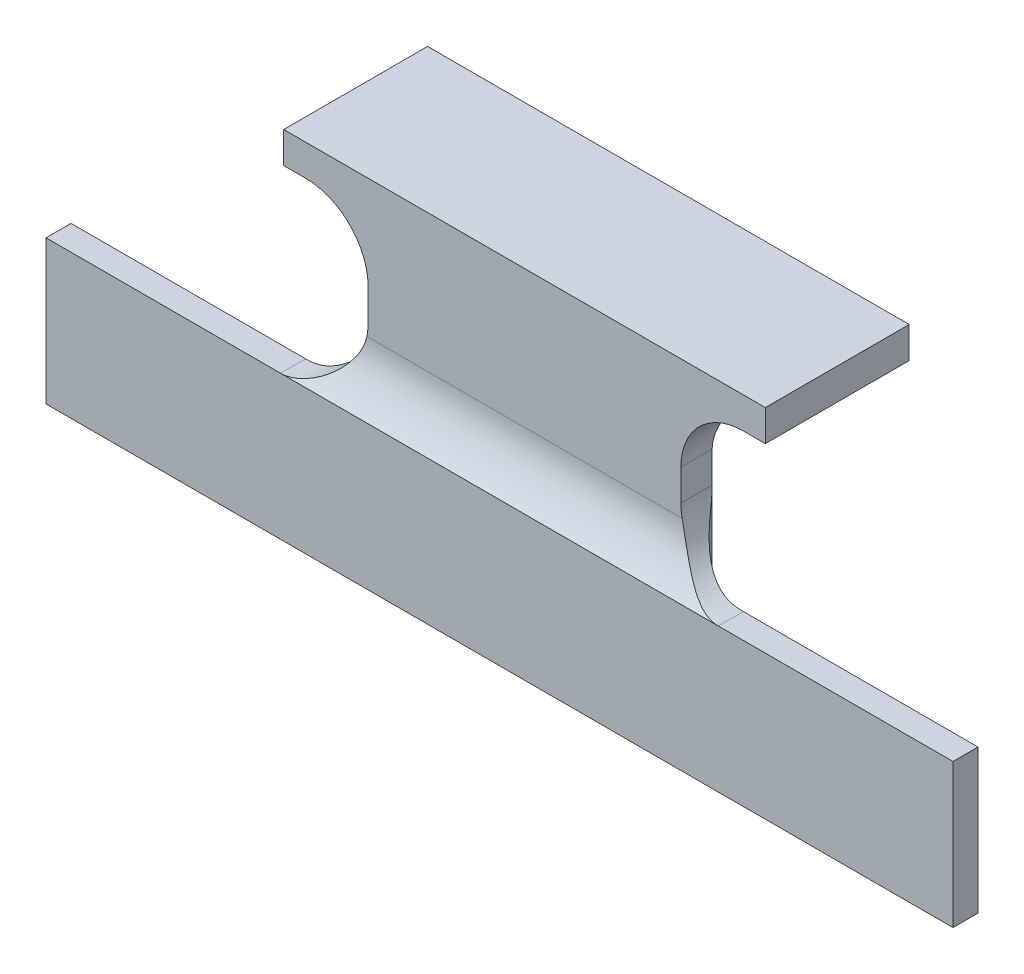
ISO-10303-21;
HEADER;
FILE_DESCRIPTION(('STEP AP214'),'2;1');
FILE_NAME('part.step','',(''),(''),'','','');
FILE_SCHEMA(('AUTOMOTIVE_DESIGN { 1 0 10303 214 1 1 1 1 }'));
ENDSEC;
DATA;
#1=APPLICATION_CONTEXT('core data for automotive mechanical design processes');
#2=APPLICATION_PROTOCOL_DEFINITION('international standard','automotive_design',2000,#1);
#3=PRODUCT_CONTEXT('',#1,'mechanical');
#4=PRODUCT('Part','Part','',(#3));
#5=PRODUCT_RELATED_PRODUCT_CATEGORY('part','',(#4));
#6=PRODUCT_DEFINITION_FORMATION('','',#4);
#7=PRODUCT_DEFINITION_CONTEXT('part definition',#1,'design');
#8=PRODUCT_DEFINITION('design','',#6,#7);
#9=PRODUCT_DEFINITION_SHAPE('','',#8);
#10=(LENGTH_UNIT() NAMED_UNIT(*) SI_UNIT(.MILLI.,.METRE.));
#11=(NAMED_UNIT(*) PLANE_ANGLE_UNIT() SI_UNIT($,.RADIAN.));
#12=(NAMED_UNIT(*) SI_UNIT($,.STERADIAN.) SOLID_ANGLE_UNIT());
#13=UNCERTAINTY_MEASURE_WITH_UNIT(LENGTH_MEASURE(1.E-05),#10,'distance_accuracy_value','');
#14=(GEOMETRIC_REPRESENTATION_CONTEXT(3) GLOBAL_UNCERTAINTY_ASSIGNED_CONTEXT((#13)) GLOBAL_UNIT_ASSIGNED_CONTEXT((#10,
#11,#12)) REPRESENTATION_CONTEXT('',''));
#15=CARTESIAN_POINT('',(0.,0.,0.));
#16=DIRECTION('',(0.,0.,1.));
#17=DIRECTION('',(1.,0.,0.));
#18=AXIS2_PLACEMENT_3D('',#15,#16,#17);
#19=CARTESIAN_POINT('',(-72.5,11.5,4.));
#20=DIRECTION('',(0.,-1.,0.));
#21=DIRECTION('',(0.,0.,-1.));
#22=AXIS2_PLACEMENT_3D('',#19,#20,#21);
#23=PLANE('',#22);
#24=DIRECTION('',(-1.,0.,0.));
#25=VECTOR('',#24,1.);
#26=CARTESIAN_POINT('',(-72.5,11.5,0.));
#27=LINE('',#26,#25);
#28=CARTESIAN_POINT('',(72.5,11.5,0.));
#29=VERTEX_POINT('',#28);
#30=CARTESIAN_POINT('',(35.,11.5,0.));
#31=VERTEX_POINT('',#30);
#32=EDGE_CURVE('E285',#29,#31,#27,.T.);
#33=ORIENTED_EDGE('',*,*,#32,.T.);
#34=DIRECTION('',(0.,0.,-1.));
#35=VECTOR('',#34,1.);
#36=CARTESIAN_POINT('',(35.,11.5,3.99999999999985));
#37=LINE('',#36,#35);
#38=CARTESIAN_POINT('',(35.,11.5,4.));
#39=VERTEX_POINT('',#38);
#40=EDGE_CURVE('E255',#31,#39,#37,.F.);
#41=ORIENTED_EDGE('',*,*,#40,.T.);
#42=DIRECTION('',(-1.,0.,0.));
#43=VECTOR('',#42,1.);
#44=CARTESIAN_POINT('',(-72.5,11.5,4.));
#45=LINE('',#44,#43);
#46=CARTESIAN_POINT('',(72.5,11.5,4.));
#47=VERTEX_POINT('',#46);
#48=EDGE_CURVE('E262',#47,#39,#45,.T.);
#49=ORIENTED_EDGE('',*,*,#48,.F.);
#50=DIRECTION('',(0.,0.,-1.));
#51=VECTOR('',#50,1.);
#52=CARTESIAN_POINT('',(72.5,11.5,4.));
#53=LINE('',#52,#51);
#54=EDGE_CURVE('E309',#47,#29,#53,.T.);
#55=ORIENTED_EDGE('',*,*,#54,.T.);
#56=EDGE_LOOP('',(#33,#41,#49,#55));
#57=FACE_BOUND('',#56,.T.);
#58=ADVANCED_FACE('F45',(#57),#23,.F.);
#59=CARTESIAN_POINT('',(0.,0.,0.));
#60=DIRECTION('',(0.,0.,1.));
#61=DIRECTION('',(1.,0.,0.));
#62=AXIS2_PLACEMENT_3D('',#59,#60,#61);
#63=PLANE('',#62);
#64=CARTESIAN_POINT('',(-35.,11.5,0.));
#65=VERTEX_POINT('',#64);
#66=CARTESIAN_POINT('',(-72.5,11.5,0.));
#67=VERTEX_POINT('',#66);
#68=EDGE_CURVE('E284',#65,#67,#27,.T.);
#69=ORIENTED_EDGE('',*,*,#68,.F.);
#70=CARTESIAN_POINT('',(-35.,21.5,0.));
#71=DIRECTION('',(0.,0.,1.));
#72=DIRECTION('',(1.,0.,0.));
#73=AXIS2_PLACEMENT_3D('',#70,#71,#72);
#74=CIRCLE('',#73,10.);
#75=CARTESIAN_POINT('',(-33.6602540378444,11.5901523343248,0.));
#76=VERTEX_POINT('',#75);
#77=EDGE_CURVE('E139',#65,#76,#74,.T.);
#78=ORIENTED_EDGE('',*,*,#77,.T.);
#79=DIRECTION('',(0.,-1.,0.));
#80=VECTOR('',#79,1.);
#81=CARTESIAN_POINT('',(-33.6602540378444,0.,0.));
#82=LINE('',#81,#80);
#83=CARTESIAN_POINT('',(-33.6602540378444,-11.5,0.));
#84=VERTEX_POINT('',#83);
#85=EDGE_CURVE('E78',#76,#84,#82,.T.);
#86=ORIENTED_EDGE('',*,*,#85,.T.);
#87=DIRECTION('',(1.,0.,0.));
#88=VECTOR('',#87,1.);
#89=CARTESIAN_POINT('',(-72.5,-11.5,0.));
#90=LINE('',#89,#88);
#91=CARTESIAN_POINT('',(-72.5,-11.5,0.));
#92=VERTEX_POINT('',#91);
#93=EDGE_CURVE('E294',#92,#84,#90,.T.);
#94=ORIENTED_EDGE('',*,*,#93,.F.);
#95=DIRECTION('',(0.,-1.,0.));
#96=VECTOR('',#95,1.);
#97=CARTESIAN_POINT('',(-72.5,11.5,0.));
#98=LINE('',#97,#96);
#99=EDGE_CURVE('E289',#67,#92,#98,.T.);
#100=ORIENTED_EDGE('',*,*,#99,.F.);
#101=EDGE_LOOP('',(#69,#78,#86,#94,#100));
#102=FACE_BOUND('',#101,.T.);
#103=ADVANCED_FACE('F193',(#102),#63,.F.);
#104=CARTESIAN_POINT('',(72.5,11.5,4.));
#105=DIRECTION('',(-1.,0.,0.));
#106=DIRECTION('',(0.,0.,1.));
#107=AXIS2_PLACEMENT_3D('',#104,#105,#106);
#108=PLANE('',#107);
#109=DIRECTION('',(0.,1.,0.));
#110=VECTOR('',#109,1.);
#111=CARTESIAN_POINT('',(72.5,11.5,0.));
#112=LINE('',#111,#110);
#113=CARTESIAN_POINT('',(72.5,-11.5,0.));
#114=VERTEX_POINT('',#113);
#115=EDGE_CURVE('E280',#114,#29,#112,.T.);
#116=ORIENTED_EDGE('',*,*,#115,.T.);
#117=ORIENTED_EDGE('',*,*,#54,.F.);
#118=DIRECTION('',(0.,1.,0.));
#119=VECTOR('',#118,1.);
#120=CARTESIAN_POINT('',(72.5,11.5,4.));
#121=LINE('',#120,#119);
#122=CARTESIAN_POINT('',(72.5,-11.5,4.));
#123=VERTEX_POINT('',#122);
#124=EDGE_CURVE('E268',#123,#47,#121,.T.);
#125=ORIENTED_EDGE('',*,*,#124,.F.);
#126=DIRECTION('',(0.,0.,-1.));
#127=VECTOR('',#126,1.);
#128=CARTESIAN_POINT('',(72.5,-11.5,4.));
#129=LINE('',#128,#127);
#130=EDGE_CURVE('E279',#123,#114,#129,.T.);
#131=ORIENTED_EDGE('',*,*,#130,.T.);
#132=EDGE_LOOP('',(#116,#117,#125,#131));
#133=FACE_BOUND('',#132,.T.);
#134=ADVANCED_FACE('F204',(#133),#108,.F.);
#135=CARTESIAN_POINT('',(-35.,11.5,4.));
#136=VERTEX_POINT('',#135);
#137=CARTESIAN_POINT('',(-72.5,11.5,4.));
#138=VERTEX_POINT('',#137);
#139=EDGE_CURVE('E263',#136,#138,#45,.T.);
#140=ORIENTED_EDGE('',*,*,#139,.F.);
#141=DIRECTION('',(0.,0.,1.));
#142=VECTOR('',#141,1.);
#143=CARTESIAN_POINT('',(-35.,11.5,4.00000000000005));
#144=LINE('',#143,#142);
#145=EDGE_CURVE('E144',#136,#65,#144,.F.);
#146=ORIENTED_EDGE('',*,*,#145,.T.);
#147=ORIENTED_EDGE('',*,*,#68,.T.);
#148=DIRECTION('',(0.,0.,-1.));
#149=VECTOR('',#148,1.);
#150=CARTESIAN_POINT('',(-72.5,11.5,4.));
#151=LINE('',#150,#149);
#152=EDGE_CURVE('E305',#138,#67,#151,.T.);
#153=ORIENTED_EDGE('',*,*,#152,.F.);
#154=EDGE_LOOP('',(#140,#146,#147,#153));
#155=FACE_BOUND('',#154,.T.);
#156=ADVANCED_FACE('F200',(#155),#23,.F.);
#157=CARTESIAN_POINT('',(-72.5,11.5,4.));
#158=DIRECTION('',(1.,0.,0.));
#159=DIRECTION('',(0.,0.,-1.));
#160=AXIS2_PLACEMENT_3D('',#157,#158,#159);
#161=PLANE('',#160);
#162=ORIENTED_EDGE('',*,*,#99,.T.);
#163=DIRECTION('',(0.,0.,-1.));
#164=VECTOR('',#163,1.);
#165=CARTESIAN_POINT('',(-72.5,-11.5,4.));
#166=LINE('',#165,#164);
#167=CARTESIAN_POINT('',(-72.5,-11.5,4.));
#168=VERTEX_POINT('',#167);
#169=EDGE_CURVE('E301',#168,#92,#166,.T.);
#170=ORIENTED_EDGE('',*,*,#169,.F.);
#171=DIRECTION('',(0.,-1.,0.));
#172=VECTOR('',#171,1.);
#173=CARTESIAN_POINT('',(-72.5,11.5,4.));
#174=LINE('',#173,#172);
#175=EDGE_CURVE('E267',#138,#168,#174,.T.);
#176=ORIENTED_EDGE('',*,*,#175,.F.);
#177=ORIENTED_EDGE('',*,*,#152,.T.);
#178=EDGE_LOOP('',(#162,#170,#176,#177));
#179=FACE_BOUND('',#178,.T.);
#180=ADVANCED_FACE('F196',(#179),#161,.F.);
#181=CARTESIAN_POINT('',(-72.5,-11.5,4.));
#182=DIRECTION('',(0.,1.,0.));
#183=DIRECTION('',(0.,0.,1.));
#184=AXIS2_PLACEMENT_3D('',#181,#182,#183);
#185=PLANE('',#184);
#186=ORIENTED_EDGE('',*,*,#93,.T.);
#187=CARTESIAN_POINT('',(-33.6602540378444,-11.5,-10.));
#188=DIRECTION('',(0.,1.,0.));
#189=DIRECTION('',(0.,0.,1.));
#190=AXIS2_PLACEMENT_3D('',#187,#188,#189);
#191=CIRCLE('',#190,10.);
#192=CARTESIAN_POINT('',(-25.,-11.5,-5.));
#193=VERTEX_POINT('',#192);
#194=EDGE_CURVE('E357',#84,#193,#191,.T.);
#195=ORIENTED_EDGE('',*,*,#194,.T.);
#196=DIRECTION('',(-1.,0.,0.));
#197=VECTOR('',#196,1.);
#198=CARTESIAN_POINT('',(-25.,-11.5,-5.));
#199=LINE('',#198,#197);
#200=CARTESIAN_POINT('',(25.,-11.5,-5.));
#201=VERTEX_POINT('',#200);
#202=EDGE_CURVE('E395',#201,#193,#199,.T.);
#203=ORIENTED_EDGE('',*,*,#202,.F.);
#204=CARTESIAN_POINT('',(33.6602540378444,-11.5,-10.));
#205=DIRECTION('',(0.,1.,0.));
#206=DIRECTION('',(0.,0.,1.));
#207=AXIS2_PLACEMENT_3D('',#204,#205,#206);
#208=CIRCLE('',#207,10.);
#209=CARTESIAN_POINT('',(33.6602540378444,-11.5,0.));
#210=VERTEX_POINT('',#209);
#211=EDGE_CURVE('E361',#201,#210,#208,.T.);
#212=ORIENTED_EDGE('',*,*,#211,.T.);
#213=EDGE_CURVE('E293',#210,#114,#90,.T.);
#214=ORIENTED_EDGE('',*,*,#213,.T.);
#215=ORIENTED_EDGE('',*,*,#130,.F.);
#216=DIRECTION('',(1.,0.,0.));
#217=VECTOR('',#216,1.);
#218=CARTESIAN_POINT('',(-72.5,-11.5,4.));
#219=LINE('',#218,#217);
#220=EDGE_CURVE('E275',#168,#123,#219,.T.);
#221=ORIENTED_EDGE('',*,*,#220,.F.);
#222=ORIENTED_EDGE('',*,*,#169,.T.);
#223=EDGE_LOOP('',(#186,#195,#203,#212,#214,#215,#221,#222));
#224=FACE_BOUND('',#223,.T.);
#225=ADVANCED_FACE('F188',(#224),#185,.F.);
#226=CARTESIAN_POINT('',(0.,0.,4.));
#227=DIRECTION('',(0.,0.,1.));
#228=DIRECTION('',(1.,0.,0.));
#229=AXIS2_PLACEMENT_3D('',#226,#227,#228);
#230=PLANE('',#229);
#231=ORIENTED_EDGE('',*,*,#124,.T.);
#232=ORIENTED_EDGE('',*,*,#48,.T.);
#233=EDGE_CURVE('E258',#39,#136,#45,.T.);
#234=ORIENTED_EDGE('',*,*,#233,.T.);
#235=ORIENTED_EDGE('',*,*,#139,.T.);
#236=ORIENTED_EDGE('',*,*,#175,.T.);
#237=ORIENTED_EDGE('',*,*,#220,.T.);
#238=EDGE_LOOP('',(#231,#232,#234,#235,#236,#237));
#239=FACE_BOUND('',#238,.T.);
#240=ADVANCED_FACE('F185',(#239),#230,.T.);
#241=ORIENTED_EDGE('',*,*,#213,.F.);
#242=DIRECTION('',(0.,1.,0.));
#243=VECTOR('',#242,1.);
#244=CARTESIAN_POINT('',(33.6602540378444,0.,0.));
#245=LINE('',#244,#243);
#246=CARTESIAN_POINT('',(33.6602540378444,11.5901523343248,0.));
#247=VERTEX_POINT('',#246);
#248=EDGE_CURVE('E354',#210,#247,#245,.T.);
#249=ORIENTED_EDGE('',*,*,#248,.T.);
#250=CARTESIAN_POINT('',(35.,21.5,0.));
#251=DIRECTION('',(0.,0.,1.));
#252=DIRECTION('',(1.,0.,0.));
#253=AXIS2_PLACEMENT_3D('',#250,#251,#252);
#254=CIRCLE('',#253,10.);
#255=EDGE_CURVE('E238',#247,#31,#254,.T.);
#256=ORIENTED_EDGE('',*,*,#255,.T.);
#257=ORIENTED_EDGE('',*,*,#32,.F.);
#258=ORIENTED_EDGE('',*,*,#115,.F.);
#259=EDGE_LOOP('',(#241,#249,#256,#257,#258));
#260=FACE_BOUND('',#259,.T.);
#261=ADVANCED_FACE('F177',(#260),#63,.F.);
#262=CARTESIAN_POINT('',(-25.,-11.5,0.));
#263=DIRECTION('',(0.,0.,1.));
#264=DIRECTION('',(1.,0.,0.));
#265=AXIS2_PLACEMENT_3D('',#262,#263,#264);
#266=PLANE('',#265);
#267=CARTESIAN_POINT('',(-35.,21.5,0.));
#268=DIRECTION('',(0.,0.,1.));
#269=DIRECTION('',(1.,0.,0.));
#270=AXIS2_PLACEMENT_3D('',#267,#268,#269);
#271=CIRCLE('',#270,10.);
#272=CARTESIAN_POINT('',(-25.,21.5,0.));
#273=VERTEX_POINT('',#272);
#274=CARTESIAN_POINT('',(-25.2020410288673,19.5,0.));
#275=VERTEX_POINT('',#274);
#276=EDGE_CURVE('E128',#273,#275,#271,.F.);
#277=ORIENTED_EDGE('',*,*,#276,.T.);
#278=CARTESIAN_POINT('',(-25.2020410288673,19.5,0.));
#279=CARTESIAN_POINT('',(-25.,19.5,0.));
#280=B_SPLINE_CURVE_WITH_KNOTS('',1,(#278,#279),.UNSPECIFIED.,.F.,.F.,(2,2),(0.,1.),.UNSPECIFIED.);
#281=CARTESIAN_POINT('',(-25.,19.5,0.));
#282=VERTEX_POINT('',#281);
#283=EDGE_CURVE('E61',#275,#282,#280,.T.);
#284=ORIENTED_EDGE('',*,*,#283,.T.);
#285=DIRECTION('',(1.,0.,0.));
#286=VECTOR('',#285,1.);
#287=CARTESIAN_POINT('',(25.,19.5,0.));
#288=LINE('',#287,#286);
#289=CARTESIAN_POINT('',(25.,19.5,0.));
#290=VERTEX_POINT('',#289);
#291=EDGE_CURVE('E152',#282,#290,#288,.T.);
#292=ORIENTED_EDGE('',*,*,#291,.T.);
#293=CARTESIAN_POINT('',(25.,19.5,0.));
#294=CARTESIAN_POINT('',(25.2020410288673,19.5,0.));
#295=B_SPLINE_CURVE_WITH_KNOTS('',1,(#293,#294),.UNSPECIFIED.,.F.,.F.,(2,2),(0.,1.),.UNSPECIFIED.);
#296=CARTESIAN_POINT('',(25.2020410288673,19.5,0.));
#297=VERTEX_POINT('',#296);
#298=EDGE_CURVE('E11',#290,#297,#295,.T.);
#299=ORIENTED_EDGE('',*,*,#298,.T.);
#300=CARTESIAN_POINT('',(35.,21.5,0.));
#301=DIRECTION('',(0.,0.,1.));
#302=DIRECTION('',(1.,0.,0.));
#303=AXIS2_PLACEMENT_3D('',#300,#301,#302);
#304=CIRCLE('',#303,10.);
#305=CARTESIAN_POINT('',(25.,21.5,0.));
#306=VERTEX_POINT('',#305);
#307=EDGE_CURVE('E103',#297,#306,#304,.F.);
#308=ORIENTED_EDGE('',*,*,#307,.T.);
#309=DIRECTION('',(0.,1.,0.));
#310=VECTOR('',#309,1.);
#311=CARTESIAN_POINT('',(25.,-11.5,0.));
#312=LINE('',#311,#310);
#313=CARTESIAN_POINT('',(25.,26.5,0.));
#314=VERTEX_POINT('',#313);
#315=EDGE_CURVE('E400',#306,#314,#312,.T.);
#316=ORIENTED_EDGE('',*,*,#315,.T.);
#317=CARTESIAN_POINT('',(35.,26.5,0.));
#318=DIRECTION('',(0.,0.,1.));
#319=DIRECTION('',(1.,0.,0.));
#320=AXIS2_PLACEMENT_3D('',#317,#318,#319);
#321=CIRCLE('',#320,10.);
#322=CARTESIAN_POINT('',(35.,36.5,0.));
#323=VERTEX_POINT('',#322);
#324=EDGE_CURVE('E340',#314,#323,#321,.F.);
#325=ORIENTED_EDGE('',*,*,#324,.T.);
#326=DIRECTION('',(1.,0.,0.));
#327=VECTOR('',#326,1.);
#328=CARTESIAN_POINT('',(-38.5,36.5,0.));
#329=LINE('',#328,#327);
#330=CARTESIAN_POINT('',(38.5,36.5,0.));
#331=VERTEX_POINT('',#330);
#332=EDGE_CURVE('E440',#323,#331,#329,.T.);
#333=ORIENTED_EDGE('',*,*,#332,.T.);
#334=DIRECTION('',(0.,-1.,0.));
#335=VECTOR('',#334,1.);
#336=CARTESIAN_POINT('',(38.5,41.5,0.));
#337=LINE('',#336,#335);
#338=CARTESIAN_POINT('',(38.5,41.5,0.));
#339=VERTEX_POINT('',#338);
#340=EDGE_CURVE('E409',#339,#331,#337,.T.);
#341=ORIENTED_EDGE('',*,*,#340,.F.);
#342=DIRECTION('',(1.,0.,0.));
#343=VECTOR('',#342,1.);
#344=CARTESIAN_POINT('',(-38.5,41.5,0.));
#345=LINE('',#344,#343);
#346=CARTESIAN_POINT('',(-38.5,41.5,0.));
#347=VERTEX_POINT('',#346);
#348=EDGE_CURVE('E450',#347,#339,#345,.T.);
#349=ORIENTED_EDGE('',*,*,#348,.F.);
#350=DIRECTION('',(0.,-1.,0.));
#351=VECTOR('',#350,1.);
#352=CARTESIAN_POINT('',(-38.5,41.5,0.));
#353=LINE('',#352,#351);
#354=CARTESIAN_POINT('',(-38.5,36.5,0.));
#355=VERTEX_POINT('',#354);
#356=EDGE_CURVE('E405',#347,#355,#353,.T.);
#357=ORIENTED_EDGE('',*,*,#356,.T.);
#358=CARTESIAN_POINT('',(-35.,36.5,0.));
#359=VERTEX_POINT('',#358);
#360=EDGE_CURVE('E437',#355,#359,#329,.T.);
#361=ORIENTED_EDGE('',*,*,#360,.T.);
#362=CARTESIAN_POINT('',(-35.,26.5,0.));
#363=DIRECTION('',(0.,0.,1.));
#364=DIRECTION('',(1.,0.,0.));
#365=AXIS2_PLACEMENT_3D('',#362,#363,#364);
#366=CIRCLE('',#365,10.);
#367=CARTESIAN_POINT('',(-25.,26.5,0.));
#368=VERTEX_POINT('',#367);
#369=EDGE_CURVE('E337',#359,#368,#366,.F.);
#370=ORIENTED_EDGE('',*,*,#369,.T.);
#371=DIRECTION('',(0.,1.,0.));
#372=VECTOR('',#371,1.);
#373=CARTESIAN_POINT('',(-25.,-11.5,0.));
#374=LINE('',#373,#372);
#375=EDGE_CURVE('E135',#273,#368,#374,.T.);
#376=ORIENTED_EDGE('',*,*,#375,.F.);
#377=EDGE_LOOP('',(#277,#284,#292,#299,#308,#316,#325,#333,#341,#349,#357,#361,#370,#376));
#378=FACE_BOUND('',#377,.T.);
#379=ADVANCED_FACE('F130',(#378),#266,.T.);
#380=CARTESIAN_POINT('',(-25.,-11.5,0.));
#381=DIRECTION('',(-1.,0.,0.));
#382=DIRECTION('',(0.,0.,1.));
#383=AXIS2_PLACEMENT_3D('',#380,#381,#382);
#384=PLANE('',#383);
#385=DIRECTION('',(0.,1.,0.));
#386=VECTOR('',#385,1.);
#387=CARTESIAN_POINT('',(-25.,-11.5,-5.));
#388=LINE('',#387,#386);
#389=CARTESIAN_POINT('',(-25.,21.5,-5.));
#390=VERTEX_POINT('',#389);
#391=CARTESIAN_POINT('',(-25.,26.5,-5.));
#392=VERTEX_POINT('',#391);
#393=EDGE_CURVE('E390',#390,#392,#388,.T.);
#394=ORIENTED_EDGE('',*,*,#393,.F.);
#395=DIRECTION('',(0.,0.,1.));
#396=VECTOR('',#395,1.);
#397=CARTESIAN_POINT('',(-25.,21.5,0.));
#398=LINE('',#397,#396);
#399=EDGE_CURVE('E372',#390,#273,#398,.T.);
#400=ORIENTED_EDGE('',*,*,#399,.T.);
#401=ORIENTED_EDGE('',*,*,#375,.T.);
#402=DIRECTION('',(0.,0.,1.));
#403=VECTOR('',#402,1.);
#404=CARTESIAN_POINT('',(-25.,26.5,-5.));
#405=LINE('',#404,#403);
#406=EDGE_CURVE('E325',#368,#392,#405,.F.);
#407=ORIENTED_EDGE('',*,*,#406,.T.);
#408=EDGE_LOOP('',(#394,#400,#401,#407));
#409=FACE_BOUND('',#408,.T.);
#410=ADVANCED_FACE('F176',(#409),#384,.T.);
#411=CARTESIAN_POINT('',(-25.,-11.5,-5.));
#412=DIRECTION('',(0.,0.,-1.));
#413=DIRECTION('',(-1.,0.,0.));
#414=AXIS2_PLACEMENT_3D('',#411,#412,#413);
#415=PLANE('',#414);
#416=EDGE_CURVE('E69',#193,#390,#388,.T.);
#417=ORIENTED_EDGE('',*,*,#416,.T.);
#418=ORIENTED_EDGE('',*,*,#393,.T.);
#419=DIRECTION('',(-1.,0.,0.));
#420=VECTOR('',#419,1.);
#421=CARTESIAN_POINT('',(25.,26.5,-5.));
#422=LINE('',#421,#420);
#423=CARTESIAN_POINT('',(25.,26.5,-5.));
#424=VERTEX_POINT('',#423);
#425=EDGE_CURVE('E333',#392,#424,#422,.F.);
#426=ORIENTED_EDGE('',*,*,#425,.T.);
#427=DIRECTION('',(0.,1.,0.));
#428=VECTOR('',#427,1.);
#429=CARTESIAN_POINT('',(25.,-11.5,-5.));
#430=LINE('',#429,#428);
#431=CARTESIAN_POINT('',(25.,21.5,-5.));
#432=VERTEX_POINT('',#431);
#433=EDGE_CURVE('E399',#432,#424,#430,.T.);
#434=ORIENTED_EDGE('',*,*,#433,.F.);
#435=EDGE_CURVE('E92',#201,#432,#430,.T.);
#436=ORIENTED_EDGE('',*,*,#435,.F.);
#437=ORIENTED_EDGE('',*,*,#202,.T.);
#438=EDGE_LOOP('',(#417,#418,#426,#434,#436,#437));
#439=FACE_BOUND('',#438,.T.);
#440=ADVANCED_FACE('F183',(#439),#415,.T.);
#441=CARTESIAN_POINT('',(25.,-11.5,0.));
#442=DIRECTION('',(1.,0.,0.));
#443=DIRECTION('',(0.,0.,-1.));
#444=AXIS2_PLACEMENT_3D('',#441,#442,#443);
#445=PLANE('',#444);
#446=ORIENTED_EDGE('',*,*,#315,.F.);
#447=DIRECTION('',(0.,0.,-1.));
#448=VECTOR('',#447,1.);
#449=CARTESIAN_POINT('',(25.,21.5,0.));
#450=LINE('',#449,#448);
#451=EDGE_CURVE('E365',#306,#432,#450,.T.);
#452=ORIENTED_EDGE('',*,*,#451,.T.);
#453=ORIENTED_EDGE('',*,*,#433,.T.);
#454=DIRECTION('',(0.,0.,-1.));
#455=VECTOR('',#454,1.);
#456=CARTESIAN_POINT('',(25.,26.5,0.));
#457=LINE('',#456,#455);
#458=EDGE_CURVE('E329',#424,#314,#457,.F.);
#459=ORIENTED_EDGE('',*,*,#458,.T.);
#460=EDGE_LOOP('',(#446,#452,#453,#459));
#461=FACE_BOUND('',#460,.T.);
#462=ADVANCED_FACE('F178',(#461),#445,.T.);
#463=CARTESIAN_POINT('',(-38.5,41.5,0.));
#464=DIRECTION('',(1.,0.,0.));
#465=DIRECTION('',(0.,0.,-1.));
#466=AXIS2_PLACEMENT_3D('',#463,#464,#465);
#467=PLANE('',#466);
#468=DIRECTION('',(0.,0.,1.));
#469=VECTOR('',#468,1.);
#470=CARTESIAN_POINT('',(-38.5,36.5,0.));
#471=LINE('',#470,#469);
#472=CARTESIAN_POINT('',(-38.5,36.5,-23.));
#473=VERTEX_POINT('',#472);
#474=EDGE_CURVE('E351',#473,#355,#471,.T.);
#475=ORIENTED_EDGE('',*,*,#474,.T.);
#476=ORIENTED_EDGE('',*,*,#356,.F.);
#477=DIRECTION('',(0.,0.,1.));
#478=VECTOR('',#477,1.);
#479=CARTESIAN_POINT('',(-38.5,41.5,0.));
#480=LINE('',#479,#478);
#481=CARTESIAN_POINT('',(-38.5,41.5,-23.));
#482=VERTEX_POINT('',#481);
#483=EDGE_CURVE('E432',#482,#347,#480,.T.);
#484=ORIENTED_EDGE('',*,*,#483,.F.);
#485=DIRECTION('',(0.,-1.,0.));
#486=VECTOR('',#485,1.);
#487=CARTESIAN_POINT('',(-38.5,41.5,-23.));
#488=LINE('',#487,#486);
#489=EDGE_CURVE('E423',#482,#473,#488,.T.);
#490=ORIENTED_EDGE('',*,*,#489,.T.);
#491=EDGE_LOOP('',(#475,#476,#484,#490));
#492=FACE_BOUND('',#491,.T.);
#493=ADVANCED_FACE('F468',(#492),#467,.F.);
#494=CARTESIAN_POINT('',(38.5,41.5,0.));
#495=DIRECTION('',(-1.,0.,0.));
#496=DIRECTION('',(0.,0.,1.));
#497=AXIS2_PLACEMENT_3D('',#494,#495,#496);
#498=PLANE('',#497);
#499=DIRECTION('',(0.,0.,-1.));
#500=VECTOR('',#499,1.);
#501=CARTESIAN_POINT('',(38.5,36.5,0.));
#502=LINE('',#501,#500);
#503=CARTESIAN_POINT('',(38.5,36.5,-23.));
#504=VERTEX_POINT('',#503);
#505=EDGE_CURVE('E433',#331,#504,#502,.T.);
#506=ORIENTED_EDGE('',*,*,#505,.T.);
#507=DIRECTION('',(0.,-1.,0.));
#508=VECTOR('',#507,1.);
#509=CARTESIAN_POINT('',(38.5,41.5,-23.));
#510=LINE('',#509,#508);
#511=CARTESIAN_POINT('',(38.5,41.5,-23.));
#512=VERTEX_POINT('',#511);
#513=EDGE_CURVE('E417',#512,#504,#510,.T.);
#514=ORIENTED_EDGE('',*,*,#513,.F.);
#515=DIRECTION('',(0.,0.,-1.));
#516=VECTOR('',#515,1.);
#517=CARTESIAN_POINT('',(38.5,41.5,0.));
#518=LINE('',#517,#516);
#519=EDGE_CURVE('E446',#339,#512,#518,.T.);
#520=ORIENTED_EDGE('',*,*,#519,.F.);
#521=ORIENTED_EDGE('',*,*,#340,.T.);
#522=EDGE_LOOP('',(#506,#514,#520,#521));
#523=FACE_BOUND('',#522,.T.);
#524=ADVANCED_FACE('F655',(#523),#498,.F.);
#525=CARTESIAN_POINT('',(-38.5,41.5,-23.));
#526=DIRECTION('',(0.,0.,1.));
#527=DIRECTION('',(1.,0.,0.));
#528=AXIS2_PLACEMENT_3D('',#525,#526,#527);
#529=PLANE('',#528);
#530=DIRECTION('',(-1.,0.,0.));
#531=VECTOR('',#530,1.);
#532=CARTESIAN_POINT('',(-38.5,36.5,-23.));
#533=LINE('',#532,#531);
#534=EDGE_CURVE('E428',#504,#473,#533,.T.);
#535=ORIENTED_EDGE('',*,*,#534,.T.);
#536=ORIENTED_EDGE('',*,*,#489,.F.);
#537=DIRECTION('',(-1.,0.,0.));
#538=VECTOR('',#537,1.);
#539=CARTESIAN_POINT('',(-38.5,41.5,-23.));
#540=LINE('',#539,#538);
#541=EDGE_CURVE('E427',#512,#482,#540,.T.);
#542=ORIENTED_EDGE('',*,*,#541,.F.);
#543=ORIENTED_EDGE('',*,*,#513,.T.);
#544=EDGE_LOOP('',(#535,#536,#542,#543));
#545=FACE_BOUND('',#544,.T.);
#546=ADVANCED_FACE('F647',(#545),#529,.F.);
#547=CARTESIAN_POINT('',(0.,41.5,0.));
#548=DIRECTION('',(0.,-1.,0.));
#549=DIRECTION('',(0.,0.,-1.));
#550=AXIS2_PLACEMENT_3D('',#547,#548,#549);
#551=PLANE('',#550);
#552=ORIENTED_EDGE('',*,*,#483,.T.);
#553=ORIENTED_EDGE('',*,*,#348,.T.);
#554=ORIENTED_EDGE('',*,*,#519,.T.);
#555=ORIENTED_EDGE('',*,*,#541,.T.);
#556=EDGE_LOOP('',(#552,#553,#554,#555));
#557=FACE_BOUND('',#556,.T.);
#558=ADVANCED_FACE('F459',(#557),#551,.F.);
#559=CARTESIAN_POINT('',(0.,36.5,0.));
#560=DIRECTION('',(0.,-1.,0.));
#561=DIRECTION('',(0.,0.,-1.));
#562=AXIS2_PLACEMENT_3D('',#559,#560,#561);
#563=PLANE('',#562);
#564=DIRECTION('',(-1.,0.,0.));
#565=VECTOR('',#564,1.);
#566=CARTESIAN_POINT('',(-25.,36.5,-15.));
#567=LINE('',#566,#565);
#568=CARTESIAN_POINT('',(35.,36.5,-15.));
#569=VERTEX_POINT('',#568);
#570=CARTESIAN_POINT('',(-35.,36.5,-15.));
#571=VERTEX_POINT('',#570);
#572=EDGE_CURVE('E313',#569,#571,#567,.T.);
#573=ORIENTED_EDGE('',*,*,#572,.T.);
#574=DIRECTION('',(0.,0.,1.));
#575=VECTOR('',#574,1.);
#576=CARTESIAN_POINT('',(-35.,36.5,0.));
#577=LINE('',#576,#575);
#578=EDGE_CURVE('E321',#571,#359,#577,.T.);
#579=ORIENTED_EDGE('',*,*,#578,.T.);
#580=ORIENTED_EDGE('',*,*,#360,.F.);
#581=ORIENTED_EDGE('',*,*,#474,.F.);
#582=ORIENTED_EDGE('',*,*,#534,.F.);
#583=ORIENTED_EDGE('',*,*,#505,.F.);
#584=ORIENTED_EDGE('',*,*,#332,.F.);
#585=DIRECTION('',(0.,0.,-1.));
#586=VECTOR('',#585,1.);
#587=CARTESIAN_POINT('',(35.,36.5,-5.00000000000001));
#588=LINE('',#587,#586);
#589=EDGE_CURVE('E317',#323,#569,#588,.T.);
#590=ORIENTED_EDGE('',*,*,#589,.T.);
#591=EDGE_LOOP('',(#573,#579,#580,#581,#582,#583,#584,#590));
#592=FACE_BOUND('',#591,.T.);
#593=ADVANCED_FACE('F220',(#592),#563,.T.);
#594=CARTESIAN_POINT('',(35.,26.5,0.));
#595=DIRECTION('',(0.,0.,1.));
#596=DIRECTION('',(1.,0.,0.));
#597=AXIS2_PLACEMENT_3D('',#594,#595,#596);
#598=CYLINDRICAL_SURFACE('',#597,10.);
#599=ORIENTED_EDGE('',*,*,#324,.F.);
#600=ORIENTED_EDGE('',*,*,#458,.F.);
#601=CARTESIAN_POINT('',(35.,26.5,-15.));
#602=DIRECTION('',(0.707106781186548,0.,0.707106781186547));
#603=DIRECTION('',(0.707106781186547,0.,-0.707106781186548));
#604=AXIS2_PLACEMENT_3D('',#601,#602,#603);
#605=ELLIPSE('',#604,14.1421356237309,10.);
#606=EDGE_CURVE('E347',#569,#424,#605,.T.);
#607=ORIENTED_EDGE('',*,*,#606,.F.);
#608=ORIENTED_EDGE('',*,*,#589,.F.);
#609=EDGE_LOOP('',(#599,#600,#607,#608));
#610=FACE_BOUND('',#609,.T.);
#611=ADVANCED_FACE('F217',(#610),#598,.F.);
#612=CARTESIAN_POINT('',(0.,26.5,-15.));
#613=DIRECTION('',(1.,0.,0.));
#614=DIRECTION('',(0.,0.,-1.));
#615=AXIS2_PLACEMENT_3D('',#612,#613,#614);
#616=CYLINDRICAL_SURFACE('',#615,10.);
#617=ORIENTED_EDGE('',*,*,#606,.T.);
#618=ORIENTED_EDGE('',*,*,#425,.F.);
#619=CARTESIAN_POINT('',(-35.,26.5,-15.));
#620=DIRECTION('',(0.707106781186548,0.,-0.707106781186547));
#621=DIRECTION('',(0.707106781186547,0.,0.707106781186548));
#622=AXIS2_PLACEMENT_3D('',#619,#620,#621);
#623=ELLIPSE('',#622,14.1421356237309,10.);
#624=EDGE_CURVE('E148',#571,#392,#623,.T.);
#625=ORIENTED_EDGE('',*,*,#624,.F.);
#626=ORIENTED_EDGE('',*,*,#572,.F.);
#627=EDGE_LOOP('',(#617,#618,#625,#626));
#628=FACE_BOUND('',#627,.T.);
#629=ADVANCED_FACE('F213',(#628),#616,.F.);
#630=CARTESIAN_POINT('',(-35.,26.5,0.));
#631=DIRECTION('',(0.,0.,-1.));
#632=DIRECTION('',(-1.,0.,0.));
#633=AXIS2_PLACEMENT_3D('',#630,#631,#632);
#634=CYLINDRICAL_SURFACE('',#633,10.);
#635=ORIENTED_EDGE('',*,*,#624,.T.);
#636=ORIENTED_EDGE('',*,*,#406,.F.);
#637=ORIENTED_EDGE('',*,*,#369,.F.);
#638=ORIENTED_EDGE('',*,*,#578,.F.);
#639=EDGE_LOOP('',(#635,#636,#637,#638));
#640=FACE_BOUND('',#639,.T.);
#641=ADVANCED_FACE('F209',(#640),#634,.F.);
#642=CARTESIAN_POINT('',(-33.6602540378444,-11.5,-10.));
#643=DIRECTION('',(0.,-1.,0.));
#644=DIRECTION('',(0.,0.,-1.));
#645=AXIS2_PLACEMENT_3D('',#642,#643,#644);
#646=CYLINDRICAL_SURFACE('',#645,10.);
#647=ORIENTED_EDGE('',*,*,#194,.F.);
#648=ORIENTED_EDGE('',*,*,#85,.F.);
#649=CARTESIAN_POINT('',(-33.6602540378444,11.5901523343248,0.));
#650=CARTESIAN_POINT('',(-33.5441351055825,11.6058489459093,1.85757215772747E-06));
#651=CARTESIAN_POINT('',(-33.4283131185959,11.6235880415275,-0.00202308816643094));
#652=CARTESIAN_POINT('',(-33.1975077403563,11.6630937414664,-0.0100453111940204));
#653=CARTESIAN_POINT('',(-33.0825242679461,11.6848599504895,-0.0160421987500163));
#654=CARTESIAN_POINT('',(-32.7394707346687,11.7560547480754,-0.0398482414415696));
#655=CARTESIAN_POINT('',(-32.5129856405518,11.8114218152781,-0.0634732193311395));
#656=CARTESIAN_POINT('',(-32.0684102381697,11.9365982015688,-0.12498297350554));
#657=CARTESIAN_POINT('',(-31.8502614267407,12.0062683437051,-0.162733018792074));
#658=CARTESIAN_POINT('',(-31.4215687231908,12.1594084543793,-0.251348389935902));
#659=CARTESIAN_POINT('',(-31.2110266135826,12.2428816322141,-0.302216767434664));
#660=CARTESIAN_POINT('',(-30.7996439818227,12.4221622297053,-0.415521260045577));
#661=CARTESIAN_POINT('',(-30.5987658599631,12.5179154391877,-0.477907034118977));
#662=CARTESIAN_POINT('',(-30.2066209641406,12.7209165659854,-0.613015910880195));
#663=CARTESIAN_POINT('',(-30.0153536041229,12.8281637811551,-0.68573838220847));
#664=CARTESIAN_POINT('',(-29.4558412200985,13.1661955351272,-0.91782040825575));
#665=CARTESIAN_POINT('',(-29.1026594316807,13.4129275802454,-1.09087301977891));
#666=CARTESIAN_POINT('',(-28.5328505979208,13.8665930145285,-1.41020943791533));
#667=CARTESIAN_POINT('',(-28.3057886761144,14.0651489289309,-1.55029477168819));
#668=CARTESIAN_POINT('',(-27.8734747433833,14.4784600858575,-1.84029020429964));
#669=CARTESIAN_POINT('',(-27.6682321062072,14.6932222235099,-1.99020448137928));
#670=CARTESIAN_POINT('',(-27.2791807369165,15.1378894238248,-2.29653631772106));
#671=CARTESIAN_POINT('',(-27.0954148476332,15.3678233698312,-2.45296605918721));
#672=CARTESIAN_POINT('',(-26.7495559230473,15.8417130851111,-2.76833662330484));
#673=CARTESIAN_POINT('',(-26.58745709816,16.0856650836543,-2.92727676241765));
#674=CARTESIAN_POINT('',(-26.3101151840888,16.5456623387999,-3.21702928393371));
#675=CARTESIAN_POINT('',(-26.1915687446599,16.7595586934323,-3.34810364061083));
#676=CARTESIAN_POINT('',(-25.9695386882112,17.1975484066854,-3.60610883363063));
#677=CARTESIAN_POINT('',(-25.8660585069626,17.4216440759537,-3.7330387197479));
#678=CARTESIAN_POINT('',(-25.6748546398809,17.8801669796112,-3.97857716743455));
#679=CARTESIAN_POINT('',(-25.5870941242364,18.1145684185943,-4.09720477205374));
#680=CARTESIAN_POINT('',(-25.4279739045829,18.594775180552,-4.32123121841755));
#681=CARTESIAN_POINT('',(-25.3566012875348,18.8405713400813,-4.42664044580649));
#682=CARTESIAN_POINT('',(-25.2195632305138,19.3931919135656,-4.63592595288996));
#683=CARTESIAN_POINT('',(-25.1576374458156,19.7026598057072,-4.73560586370726));
#684=CARTESIAN_POINT('',(-25.0865590840435,20.1774127056504,-4.85278246362933));
#685=CARTESIAN_POINT('',(-25.0665161692218,20.3371566278386,-4.88642250316279));
#686=CARTESIAN_POINT('',(-25.0340727841635,20.659486168332,-4.94134148552896));
#687=CARTESIAN_POINT('',(-25.0216667087673,20.8220696121818,-4.96262949363849));
#688=CARTESIAN_POINT('',(-25.0088459281176,21.070846504109,-4.98470255961775));
#689=CARTESIAN_POINT('',(-25.0055340775925,21.1564836900924,-4.9904238900863));
#690=CARTESIAN_POINT('',(-25.0011090155155,21.3280751264558,-4.99807875228804));
#691=CARTESIAN_POINT('',(-24.9999981586369,21.4140296179477,-5.00000822738966));
#692=CARTESIAN_POINT('',(-25.,21.5,-4.99999999999999));
#693=B_SPLINE_CURVE_WITH_KNOTS('',3,(#649,#650,#651,#652,#653,#654,#655,#656,#657,#658,#659,
#660,#661,#662,#663,#664,#665,#666,#667,#668,#669,#670,#671,#672,#673,#674,#675,#676,#677,#678,
#679,#680,#681,#682,#683,#684,#685,#686,#687,#688,#689,#690,#691,#692),.UNSPECIFIED.,.F.,.F.,(4,
2,2,2,2,2,2,2,2,2,2,2,2,2,2,2,2,2,2,2,2,4),(0.,0.351449931985009,0.702865384272999,
1.40475599551244,2.10011560762175,2.79563712334183,3.48818764254481,4.18069587932181,
5.56830929523998,6.56490110220078,7.56191933780481,8.56089369807018,9.55960058979415,
10.3914162810679,11.2234213668772,12.053450886024,12.8828241117607,13.8717572444736,
14.3646396949088,14.8571599550513,15.1147365281915,15.3725885141742),.UNSPECIFIED.);
#694=EDGE_CURVE('E154',#76,#390,#693,.T.);
#695=ORIENTED_EDGE('',*,*,#694,.T.);
#696=ORIENTED_EDGE('',*,*,#416,.F.);
#697=EDGE_LOOP('',(#647,#648,#695,#696));
#698=FACE_BOUND('',#697,.T.);
#699=ADVANCED_FACE('F212',(#698),#646,.F.);
#700=CARTESIAN_POINT('',(33.6602540378444,-11.5,-10.));
#701=DIRECTION('',(0.,1.,0.));
#702=DIRECTION('',(0.,0.,1.));
#703=AXIS2_PLACEMENT_3D('',#700,#701,#702);
#704=CYLINDRICAL_SURFACE('',#703,10.);
#705=ORIENTED_EDGE('',*,*,#211,.F.);
#706=ORIENTED_EDGE('',*,*,#435,.T.);
#707=CARTESIAN_POINT('',(25.,21.5,-5.));
#708=CARTESIAN_POINT('',(24.9999578630266,21.331138661004,-5.00015410891583));
#709=CARTESIAN_POINT('',(25.0042750498659,21.1623800593156,-4.99259500573798));
#710=CARTESIAN_POINT('',(25.0212788863177,20.8269242723538,-4.96327435551715));
#711=CARTESIAN_POINT('',(25.0339451524579,20.660223071356,-4.94154739930427));
#712=CARTESIAN_POINT('',(25.0670289562496,20.3325965060979,-4.88556448422723));
#713=CARTESIAN_POINT('',(25.087316689335,20.1716212826515,-4.85151867240624));
#714=CARTESIAN_POINT('',(25.135186890747,19.8533769753662,-4.77263233648156));
#715=CARTESIAN_POINT('',(25.1627743828741,19.6961105254538,-4.72778438009921));
#716=CARTESIAN_POINT('',(25.2393112183683,19.3129907995434,-4.60602117537619));
#717=CARTESIAN_POINT('',(25.2922105520998,19.0895723188794,-4.52393237637718));
#718=CARTESIAN_POINT('',(25.4114281614062,18.6520590027755,-4.34594396743277));
#719=CARTESIAN_POINT('',(25.4777529899565,18.4379687827077,-4.25003761976558));
#720=CARTESIAN_POINT('',(25.6235948454625,18.0167313359506,-4.04787528249081));
#721=CARTESIAN_POINT('',(25.703229632153,17.8096679358523,-3.94153075709451));
#722=CARTESIAN_POINT('',(25.8746642537527,17.4040616909882,-3.72274476182348));
#723=CARTESIAN_POINT('',(25.9664631637927,17.2055181999498,-3.6103037558633));
#724=CARTESIAN_POINT('',(26.2064790601464,16.7277350489807,-3.32999144624038));
#725=CARTESIAN_POINT('',(26.3613464361213,16.4529379656755,-3.16020366477651));
#726=CARTESIAN_POINT('',(26.6960122118007,15.9194139413076,-2.81971899978534));
#727=CARTESIAN_POINT('',(26.8758213941749,15.660694021037,-2.64902175394096));
#728=CARTESIAN_POINT('',(27.2599377798786,15.1603953550002,-2.3122815987264));
#729=CARTESIAN_POINT('',(27.4641709301179,14.9187681604275,-2.14622641329996));
#730=CARTESIAN_POINT('',(27.8977936343961,14.4530287790474,-1.82276497473384));
#731=CARTESIAN_POINT('',(28.1271711181915,14.2289082760798,-1.66535462574114));
#732=CARTESIAN_POINT('',(28.5446120797009,13.8591313599935,-1.40506170160147));
#733=CARTESIAN_POINT('',(28.7266771197192,13.7088533642575,-1.29909310271389));
#734=CARTESIAN_POINT('',(29.1040088780332,13.4195431652476,-1.09570093600413));
#735=CARTESIAN_POINT('',(29.2992721412331,13.280508039532,-0.998275147027658));
#736=CARTESIAN_POINT('',(29.7021381705926,13.0152701753586,-0.81401986149135));
#737=CARTESIAN_POINT('',(29.9097019993841,12.889030047693,-0.727159333256734));
#738=CARTESIAN_POINT('',(30.3371379064132,12.6502750011847,-0.565536782370336));
#739=CARTESIAN_POINT('',(30.5570104852124,12.5377606411223,-0.490775252232065));
#740=CARTESIAN_POINT('',(31.0034458132913,12.3301096153531,-0.356631511994958));
#741=CARTESIAN_POINT('',(31.2297778890562,12.2346630793497,-0.296964564651452));
#742=CARTESIAN_POINT('',(31.691866697931,12.0598060632694,-0.192781720289024));
#743=CARTESIAN_POINT('',(31.9276203004626,11.9803903087056,-0.148260836560163));
#744=CARTESIAN_POINT('',(32.409683109722,11.8380071877787,-0.0754782248338641));
#745=CARTESIAN_POINT('',(32.6560841417047,11.7752453209692,-0.0474148852882405));
#746=CARTESIAN_POINT('',(33.0298435434967,11.6951650165488,-0.0191051806833367));
#747=CARTESIAN_POINT('',(33.1552351615651,11.6708001000183,-0.0119659677474295));
#748=CARTESIAN_POINT('',(33.4070502679733,11.6268620048558,-0.00241173969494199));
#749=CARTESIAN_POINT('',(33.5334738913508,11.6072894640374,2.64689680802588E-06));
#750=CARTESIAN_POINT('',(33.6602540378444,11.5901523343248,0.));
#751=B_SPLINE_CURVE_WITH_KNOTS('',3,(#707,#708,#709,#710,#711,#712,#713,#714,#715,#716,#717,
#718,#719,#720,#721,#722,#723,#724,#725,#726,#727,#728,#729,#730,#731,#732,#733,#734,#735,#736,
#737,#738,#739,#740,#741,#742,#743,#744,#745,#746,#747,#748,#749,#750),.UNSPECIFIED.,.F.,.F.,(4,
2,2,2,2,2,2,2,2,2,2,2,2,2,2,2,2,2,2,2,2,4),(0.,0.506195694611535,1.01116011591187,
1.50788783167774,2.00495829587117,2.73521481767779,3.46582864045142,4.20328659970802,
4.94068852029885,6.01401991358553,7.08781677669153,8.15843673299288,9.22854498284759,
10.0042080901381,10.7796689211354,11.5527941026288,12.3259507477911,13.0832024235782,
13.8402045389914,14.6061537683661,14.9898041721534,15.3735056079576),.UNSPECIFIED.);
#752=EDGE_CURVE('E230',#432,#247,#751,.T.);
#753=ORIENTED_EDGE('',*,*,#752,.T.);
#754=ORIENTED_EDGE('',*,*,#248,.F.);
#755=EDGE_LOOP('',(#705,#706,#753,#754));
#756=FACE_BOUND('',#755,.T.);
#757=ADVANCED_FACE('F225',(#756),#704,.F.);
#758=CARTESIAN_POINT('',(-35.,21.5,0.));
#759=DIRECTION('',(0.,0.,1.));
#760=DIRECTION('',(1.,0.,0.));
#761=AXIS2_PLACEMENT_3D('',#758,#759,#760);
#762=CYLINDRICAL_SURFACE('',#761,10.);
#763=ORIENTED_EDGE('',*,*,#77,.F.);
#764=ORIENTED_EDGE('',*,*,#145,.F.);
#765=CARTESIAN_POINT('',(-25.2020410288673,19.5,0.));
#766=CARTESIAN_POINT('',(-25.2260559218042,19.3823416338482,-1.90835834237621E-06));
#767=CARTESIAN_POINT('',(-25.2521901419653,19.265138649336,0.00207704827325713));
#768=CARTESIAN_POINT('',(-25.3086196373912,19.03189594926,0.0102807784787128));
#769=CARTESIAN_POINT('',(-25.3389144079658,18.9158560944332,0.0164050616820372));
#770=CARTESIAN_POINT('',(-25.4358381487499,18.5701544392901,0.0406492025362567));
#771=CARTESIAN_POINT('',(-25.5085771965155,18.3425652438332,0.0646410386823495));
#772=CARTESIAN_POINT('',(-25.6686028802703,17.8971496621985,0.126754009291768));
#773=CARTESIAN_POINT('',(-25.7557421259292,17.679250180377,0.164736349200014));
#774=CARTESIAN_POINT('',(-25.9440140975251,17.25222593198,0.253457978453432));
#775=CARTESIAN_POINT('',(-26.0451506186575,17.0431035653248,0.304200730692174));
#776=CARTESIAN_POINT('',(-26.259762074719,16.635743801112,0.416656765104777));
#777=CARTESIAN_POINT('',(-26.3731754149575,16.4374589471251,0.478316185084902));
#778=CARTESIAN_POINT('',(-26.611614638241,16.0514692492507,0.611212007940084));
#779=CARTESIAN_POINT('',(-26.7366396876901,15.8637636474388,0.68244772350397));
#780=CARTESIAN_POINT('',(-27.1284354284279,15.3161363275495,0.908720796537012));
#781=CARTESIAN_POINT('',(-27.4114325224968,14.9726303018908,1.07605629978083));
#782=CARTESIAN_POINT('',(-27.9219447639928,14.4292876235893,1.37717675863834));
#783=CARTESIAN_POINT('',(-28.1401975877727,14.2175071749264,1.50571100571596));
#784=CARTESIAN_POINT('',(-28.5930469128807,13.8160905028241,1.76891844416976));
#785=CARTESIAN_POINT('',(-28.8276503013938,13.6264637020533,1.90359421412036));
#786=CARTESIAN_POINT('',(-29.3125686967427,13.2693258241191,2.17509651201528));
#787=CARTESIAN_POINT('',(-29.5629073946031,13.1018493329151,2.31192603869512));
#788=CARTESIAN_POINT('',(-30.0786431844474,12.7895994242529,2.58291310670564));
#789=CARTESIAN_POINT('',(-30.3440341270187,12.644816825175,2.7170717093749));
#790=CARTESIAN_POINT('',(-30.809518580022,12.4178362035685,2.93882357943158));
#791=CARTESIAN_POINT('',(-31.0057862610676,12.329773667119,3.0284809938458));
#792=CARTESIAN_POINT('',(-31.4060639279712,12.1656327829838,3.20137863082712));
#793=CARTESIAN_POINT('',(-31.6100739159421,12.0895544385689,3.28461885164288));
#794=CARTESIAN_POINT('',(-32.0245812918999,11.950424795478,3.44143000286627));
#795=CARTESIAN_POINT('',(-32.235031722929,11.8872971424255,3.51505661848576));
#796=CARTESIAN_POINT('',(-32.6633084965671,11.7743195869047,3.65006906816484));
#797=CARTESIAN_POINT('',(-32.8811319981907,11.7244646344017,3.71145955562016));
#798=CARTESIAN_POINT('',(-33.2548904905842,11.6522194972642,3.80204986273115));
#799=CARTESIAN_POINT('',(-33.4091234137062,11.626104176015,3.83533278468329));
#800=CARTESIAN_POINT('',(-33.7201784036154,11.5809907327577,3.89339389663794));
#801=CARTESIAN_POINT('',(-33.8769995295864,11.5619900815616,3.9181751086431));
#802=CARTESIAN_POINT('',(-34.1942246551769,11.5312315311026,3.95852491689742));
#803=CARTESIAN_POINT('',(-34.3546489694543,11.5195513657259,3.97399457053644));
#804=CARTESIAN_POINT('',(-34.6767022236542,11.503919411016,3.99477466603747));
#805=CARTESIAN_POINT('',(-34.8383323048068,11.4999762306101,4.00007379103001));
#806=CARTESIAN_POINT('',(-35.,11.5,3.99999999999991));
#807=B_SPLINE_CURVE_WITH_KNOTS('',3,(#765,#766,#767,#768,#769,#770,#771,#772,#773,#774,#775,
#776,#777,#778,#779,#780,#781,#782,#783,#784,#785,#786,#787,#788,#789,#790,#791,#792,#793,#794,
#795,#796,#797,#798,#799,#800,#801,#802,#803,#804,#805,#806),.UNSPECIFIED.,.F.,.F.,(4,2,2,2,2,2,
2,2,2,2,2,2,2,2,2,2,2,2,2,2,4),(0.,0.360172738915306,0.720301826053638,1.43950720887079,
2.15176177939061,2.86420984902607,3.57323602041077,4.28221133061615,5.70338011854545,
6.69281392744408,7.68266705435443,8.67404795741897,9.66502672103394,10.3637435725444,
11.0624606147435,11.7569316350306,12.4511380421576,12.930571401975,13.4098341662637,
13.8941034831072,14.3789113405465),.UNSPECIFIED.);
#808=EDGE_CURVE('E50',#275,#136,#807,.T.);
#809=ORIENTED_EDGE('',*,*,#808,.F.);
#810=ORIENTED_EDGE('',*,*,#276,.F.);
#811=ORIENTED_EDGE('',*,*,#399,.F.);
#812=ORIENTED_EDGE('',*,*,#694,.F.);
#813=EDGE_LOOP('',(#763,#764,#809,#810,#811,#812));
#814=FACE_BOUND('',#813,.T.);
#815=ADVANCED_FACE('F47',(#814),#762,.F.);
#816=CARTESIAN_POINT('',(-72.5,19.5,10.));
#817=DIRECTION('',(-1.,0.,0.));
#818=DIRECTION('',(0.,0.,1.));
#819=AXIS2_PLACEMENT_3D('',#816,#817,#818);
#820=CYLINDRICAL_SURFACE('',#819,10.);
#821=ORIENTED_EDGE('',*,*,#808,.T.);
#822=ORIENTED_EDGE('',*,*,#233,.F.);
#823=CARTESIAN_POINT('',(35.,11.5,4.));
#824=CARTESIAN_POINT('',(34.9037053857546,11.4999982912243,4.00000664473222));
#825=CARTESIAN_POINT('',(34.8074261739068,11.5013912963637,3.99814447351168));
#826=CARTESIAN_POINT('',(34.6151024858757,11.5069472706104,3.99074547690351));
#827=CARTESIAN_POINT('',(34.5190579781445,11.5111098442603,3.98520917613275));
#828=CARTESIAN_POINT('',(34.2319475024064,11.5276998452718,3.9632138463065));
#829=CARTESIAN_POINT('',(34.041494648478,11.5442297335312,3.94136785370379));
#830=CARTESIAN_POINT('',(33.6662369104043,11.5875667674692,3.88488504680257));
#831=CARTESIAN_POINT('',(33.4813910927896,11.6142417279596,3.85041294928807));
#832=CARTESIAN_POINT('',(33.1157649737884,11.6773678460226,3.77031121492734));
#833=CARTESIAN_POINT('',(32.9349869770303,11.7138244013786,3.72467541884138));
#834=CARTESIAN_POINT('',(32.5091769901847,11.8118495755425,3.60465553205959));
#835=CARTESIAN_POINT('',(32.2663346457886,11.8776772789124,3.5259790302371));
#836=CARTESIAN_POINT('',(31.7904719190096,12.0257667004196,3.35556083232461));
#837=CARTESIAN_POINT('',(31.5574555248612,12.108035015311,3.26381389601219));
#838=CARTESIAN_POINT('',(31.0999116165821,12.2885850513769,3.07085423102811));
#839=CARTESIAN_POINT('',(30.8754454060653,12.3869625180221,2.96958654966267));
#840=CARTESIAN_POINT('',(30.436403938743,12.5987087907666,2.76161562619105));
#841=CARTESIAN_POINT('',(30.2218274586653,12.7120757360526,2.65491305978771));
#842=CARTESIAN_POINT('',(29.791816513251,12.9595416980031,2.43353821716297));
#843=CARTESIAN_POINT('',(29.5768855259607,13.0943983840135,2.31873553255616));
#844=CARTESIAN_POINT('',(29.1578192691239,13.3800721555726,2.08924369575552));
#845=CARTESIAN_POINT('',(28.9536847170514,13.5308902998419,1.97455455160272));
#846=CARTESIAN_POINT('',(28.5568998235748,13.8481461674805,1.74806216180308));
#847=CARTESIAN_POINT('',(28.364230624543,14.0145570146806,1.63625435906706));
#848=CARTESIAN_POINT('',(27.9906497396195,14.3631753729901,1.41773045229719));
#849=CARTESIAN_POINT('',(27.8097369196915,14.5453813565099,1.31101385742328));
#850=CARTESIAN_POINT('',(27.474199194336,14.9106949537401,1.11304225900036));
#851=CARTESIAN_POINT('',(27.3186243003532,15.0926268333478,1.02123038945005));
#852=CARTESIAN_POINT('',(27.0191582624582,15.469730908208,0.845755709951675));
#853=CARTESIAN_POINT('',(26.8752711815761,15.6649076648625,0.762095731842653));
#854=CARTESIAN_POINT('',(26.6007087411452,16.0675832579186,0.605048554361105));
#855=CARTESIAN_POINT('',(26.470004419418,16.2750534191329,0.531638692936414));
#856=CARTESIAN_POINT('',(26.2228149599938,16.7018981909237,0.396840965372089));
#857=CARTESIAN_POINT('',(26.1063207416203,16.9212650682805,0.335445406417808));
#858=CARTESIAN_POINT('',(25.9088550484976,17.3295521172657,0.236557637132427));
#859=CARTESIAN_POINT('',(25.8252896479592,17.5166597392254,0.196746138900988));
#860=CARTESIAN_POINT('',(25.6692685623621,17.8972593113306,0.12737971461117));
#861=CARTESIAN_POINT('',(25.5968095707574,18.0907493404087,0.0978217326025381));
#862=CARTESIAN_POINT('',(25.4632348217373,18.4844485050085,0.0497140498288147));
#863=CARTESIAN_POINT('',(25.402199245962,18.6846942829301,0.031240291819252));
#864=CARTESIAN_POINT('',(25.2925972637889,19.0894929950191,0.00636046465602372));
#865=CARTESIAN_POINT('',(25.2440422400815,19.2940496782374,-3.46218366954423E-05));
#866=CARTESIAN_POINT('',(25.2020410288673,19.5,0.));
#867=B_SPLINE_CURVE_WITH_KNOTS('',3,(#823,#824,#825,#826,#827,#828,#829,#830,#831,#832,#833,
#834,#835,#836,#837,#838,#839,#840,#841,#842,#843,#844,#845,#846,#847,#848,#849,#850,#851,#852,
#853,#854,#855,#856,#857,#858,#859,#860,#861,#862,#863,#864,#865,#866),.UNSPECIFIED.,.F.,.F.,(4,
2,2,2,2,2,2,2,2,2,2,2,2,2,2,2,2,2,2,2,2,4),(0.,0.288826067048816,0.577610902445098,
1.15395584473321,1.72303520504263,2.29242924895741,3.08203573914687,3.87195969540376,
4.6667614125616,5.46146455448209,6.29628426641832,7.13115938653779,7.96462106620624,
8.79800222931708,9.56646879038748,10.3352013600115,11.1022064696158,11.8687188435955,
12.4943782303675,13.1198509855542,13.7495615884039,14.3798444872108),.UNSPECIFIED.);
#868=EDGE_CURVE('E149',#297,#39,#867,.F.);
#869=ORIENTED_EDGE('',*,*,#868,.F.);
#870=ORIENTED_EDGE('',*,*,#298,.F.);
#871=ORIENTED_EDGE('',*,*,#291,.F.);
#872=ORIENTED_EDGE('',*,*,#283,.F.);
#873=EDGE_LOOP('',(#821,#822,#869,#870,#871,#872));
#874=FACE_BOUND('',#873,.T.);
#875=ADVANCED_FACE('F150',(#874),#820,.F.);
#876=CARTESIAN_POINT('',(35.,21.5,0.));
#877=DIRECTION('',(0.,0.,-1.));
#878=DIRECTION('',(-1.,0.,0.));
#879=AXIS2_PLACEMENT_3D('',#876,#877,#878);
#880=CYLINDRICAL_SURFACE('',#879,10.);
#881=ORIENTED_EDGE('',*,*,#868,.T.);
#882=ORIENTED_EDGE('',*,*,#40,.F.);
#883=ORIENTED_EDGE('',*,*,#255,.F.);
#884=ORIENTED_EDGE('',*,*,#752,.F.);
#885=ORIENTED_EDGE('',*,*,#451,.F.);
#886=ORIENTED_EDGE('',*,*,#307,.F.);
#887=EDGE_LOOP('',(#881,#882,#883,#884,#885,#886));
#888=FACE_BOUND('',#887,.T.);
#889=ADVANCED_FACE('F241',(#888),#880,.F.);
#890=CLOSED_SHELL('',(#58,#103,#134,#156,#180,#225,#240,#261,#379,#410,#440,#462,#493,#524,#546,
#558,#593,#611,#629,#641,#699,#757,#815,#875,#889));
#891=MANIFOLD_SOLID_BREP('B2',#890);
#892=ADVANCED_BREP_SHAPE_REPRESENTATION('',(#18,#891),#14);
#893=SHAPE_DEFINITION_REPRESENTATION(#9,#892);
ENDSEC;
END-ISO-10303-21;
